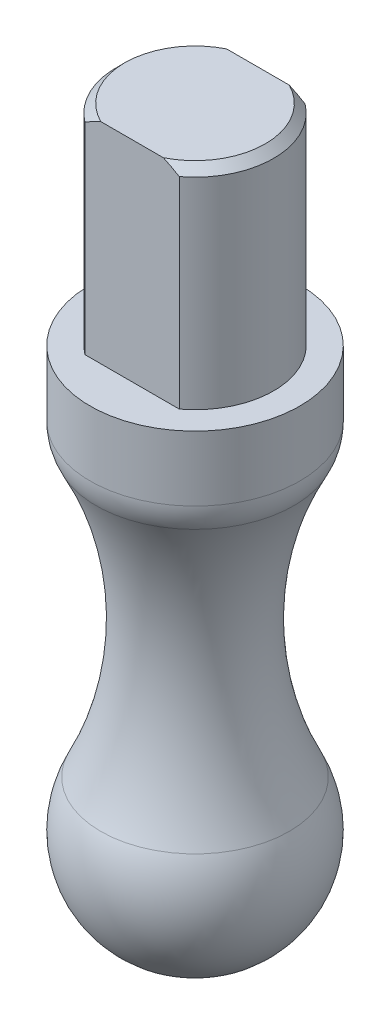
ISO-10303-21;
HEADER;
FILE_DESCRIPTION(('STEP AP214'),'2;1');
FILE_NAME('part.step','',(''),(''),'','','');
FILE_SCHEMA(('AUTOMOTIVE_DESIGN { 1 0 10303 214 1 1 1 1 }'));
ENDSEC;
DATA;
#1=APPLICATION_CONTEXT('core data for automotive mechanical design processes');
#2=APPLICATION_PROTOCOL_DEFINITION('international standard','automotive_design',2000,#1);
#3=PRODUCT_CONTEXT('',#1,'mechanical');
#4=PRODUCT('Part','Part','',(#3));
#5=PRODUCT_RELATED_PRODUCT_CATEGORY('part','',(#4));
#6=PRODUCT_DEFINITION_FORMATION('','',#4);
#7=PRODUCT_DEFINITION_CONTEXT('part definition',#1,'design');
#8=PRODUCT_DEFINITION('design','',#6,#7);
#9=PRODUCT_DEFINITION_SHAPE('','',#8);
#10=(LENGTH_UNIT() NAMED_UNIT(*) SI_UNIT(.MILLI.,.METRE.));
#11=(NAMED_UNIT(*) PLANE_ANGLE_UNIT() SI_UNIT($,.RADIAN.));
#12=(NAMED_UNIT(*) SI_UNIT($,.STERADIAN.) SOLID_ANGLE_UNIT());
#13=UNCERTAINTY_MEASURE_WITH_UNIT(LENGTH_MEASURE(1.E-05),#10,'distance_accuracy_value','');
#14=(GEOMETRIC_REPRESENTATION_CONTEXT(3) GLOBAL_UNCERTAINTY_ASSIGNED_CONTEXT((#13)) GLOBAL_UNIT_ASSIGNED_CONTEXT((#10,
#11,#12)) REPRESENTATION_CONTEXT('',''));
#15=CARTESIAN_POINT('',(0.,0.,0.));
#16=DIRECTION('',(0.,0.,1.));
#17=DIRECTION('',(1.,0.,0.));
#18=AXIS2_PLACEMENT_3D('',#15,#16,#17);
#19=CARTESIAN_POINT('',(0.,0.,0.));
#20=DIRECTION('',(0.,-1.,0.));
#21=DIRECTION('',(0.,0.,-1.));
#22=AXIS2_PLACEMENT_3D('',#19,#20,#21);
#23=CYLINDRICAL_SURFACE('',#22,9.52500000000001);
#24=CARTESIAN_POINT('',(0.,-1.01600000000001,0.));
#25=DIRECTION('',(0.,1.,0.));
#26=DIRECTION('',(0.,0.,1.));
#27=AXIS2_PLACEMENT_3D('',#24,#25,#26);
#28=CIRCLE('',#27,9.52500000000001);
#29=CARTESIAN_POINT('',(-5.71500000000001,-1.01600000000001,7.62));
#30=VERTEX_POINT('',#29);
#31=CARTESIAN_POINT('',(-5.71500000000001,-1.01600000000001,-7.62));
#32=VERTEX_POINT('',#31);
#33=EDGE_CURVE('E128',#30,#32,#28,.F.);
#34=ORIENTED_EDGE('',*,*,#33,.T.);
#35=DIRECTION('',(0.,1.,0.));
#36=VECTOR('',#35,1.);
#37=CARTESIAN_POINT('',(-5.71500000000001,-36.9876626202181,-7.62));
#38=LINE('',#37,#36);
#39=CARTESIAN_POINT('',(-5.71500000000001,-25.4,-7.62));
#40=VERTEX_POINT('',#39);
#41=EDGE_CURVE('E99',#40,#32,#38,.T.);
#42=ORIENTED_EDGE('',*,*,#41,.F.);
#43=CARTESIAN_POINT('',(0.,-25.4,0.));
#44=DIRECTION('',(0.,-1.,0.));
#45=DIRECTION('',(0.,0.,-1.));
#46=AXIS2_PLACEMENT_3D('',#43,#44,#45);
#47=CIRCLE('',#46,9.525);
#48=CARTESIAN_POINT('',(-5.71500000000001,-25.4,7.62));
#49=VERTEX_POINT('',#48);
#50=EDGE_CURVE('E108',#49,#40,#47,.T.);
#51=ORIENTED_EDGE('',*,*,#50,.F.);
#52=DIRECTION('',(0.,1.,0.));
#53=VECTOR('',#52,1.);
#54=CARTESIAN_POINT('',(-5.71500000000001,-36.9876626202181,7.62));
#55=LINE('',#54,#53);
#56=EDGE_CURVE('E187',#49,#30,#55,.T.);
#57=ORIENTED_EDGE('',*,*,#56,.T.);
#58=EDGE_LOOP('',(#34,#42,#51,#57));
#59=FACE_BOUND('',#58,.T.);
#60=ADVANCED_FACE('F34',(#59),#23,.T.);
#61=CARTESIAN_POINT('',(0.,-1.01600000000001,0.));
#62=DIRECTION('',(0.,-1.,0.));
#63=DIRECTION('',(0.,0.,-1.));
#64=AXIS2_PLACEMENT_3D('',#61,#62,#63);
#65=CONICAL_SURFACE('',#64,9.52500000000001,0.785398163397449);
#66=CARTESIAN_POINT('',(-12.6002400260275,-6.21616379241686,-7.62));
#67=CARTESIAN_POINT('',(-12.4119264966585,-6.05502939329435,-7.62));
#68=CARTESIAN_POINT('',(-12.2231401457723,-5.89444801391057,-7.62));
#69=CARTESIAN_POINT('',(-11.8444971887159,-5.57454492782977,-7.62));
#70=CARTESIAN_POINT('',(-11.6546405618792,-5.41522324560065,-7.62));
#71=CARTESIAN_POINT('',(-11.0830984830118,-4.93922861497026,-7.62));
#72=CARTESIAN_POINT('',(-10.6996292815108,-4.6246878556136,-7.62));
#73=CARTESIAN_POINT('',(-9.91639165935729,-3.99474337740364,-7.62));
#74=CARTESIAN_POINT('',(-9.51646133209357,-3.67954051124963,-7.62));
#75=CARTESIAN_POINT('',(-8.70855353596993,-3.0597482007805,-7.62));
#76=CARTESIAN_POINT('',(-8.30057812662822,-2.75515609398979,-7.62));
#77=CARTESIAN_POINT('',(-7.68026695510987,-2.30905739565239,-7.62));
#78=CARTESIAN_POINT('',(-7.47190584485932,-2.1620232317329,-7.62));
#79=CARTESIAN_POINT('',(-7.05210463521392,-1.87239896676503,-7.62));
#80=CARTESIAN_POINT('',(-6.84066450012905,-1.72980891729016,-7.62));
#81=CARTESIAN_POINT('',(-6.41407234461868,-1.44985552219947,-7.62));
#82=CARTESIAN_POINT('',(-6.19891719122192,-1.31249693616154,-7.62));
#83=CARTESIAN_POINT('',(-5.76457198568067,-1.04429785721841,-7.62));
#84=CARTESIAN_POINT('',(-5.54538202033874,-0.91345722431372,-7.62));
#85=CARTESIAN_POINT('',(-5.10455175226511,-0.660979042474094,-7.62));
#86=CARTESIAN_POINT('',(-4.88295561732992,-0.539264757605271,-7.62));
#87=CARTESIAN_POINT('',(-4.43468960688682,-0.305436956322044,-7.62));
#88=CARTESIAN_POINT('',(-4.2080191426257,-0.193324561333724,-7.62));
#89=CARTESIAN_POINT('',(-3.74952912308934,0.0188792942806856,-7.62));
#90=CARTESIAN_POINT('',(-3.51771869892728,0.118990319785317,-7.62));
#91=CARTESIAN_POINT('',(-3.04837069776734,0.30469951224618,-7.62));
#92=CARTESIAN_POINT('',(-2.81083468655119,0.3903015966797,-7.62));
#93=CARTESIAN_POINT('',(-2.32262742974571,0.546343159005187,-7.62));
#94=CARTESIAN_POINT('',(-2.07177721989617,0.616230901844984,-7.62));
#95=CARTESIAN_POINT('',(-1.56489411798422,0.733872673064761,-7.62));
#96=CARTESIAN_POINT('',(-1.30886205630714,0.781630218926455,-7.62));
#97=CARTESIAN_POINT('',(-0.794509923851618,0.851904511274271,-7.62));
#98=CARTESIAN_POINT('',(-0.536206146430472,0.87453822094371,-7.62));
#99=CARTESIAN_POINT('',(-0.0186257909267567,0.893365435879163,-7.62));
#100=CARTESIAN_POINT('',(0.240650749791294,0.889559946509033,-7.62));
#101=CARTESIAN_POINT('',(0.756999941778125,0.855820538821561,-7.62));
#102=CARTESIAN_POINT('',(1.01407568534686,0.825932955063539,-7.62));
#103=CARTESIAN_POINT('',(1.52424659983722,0.742125944816866,-7.62));
#104=CARTESIAN_POINT('',(1.77734110753895,0.688202557276531,-7.62));
#105=CARTESIAN_POINT('',(2.27959418179336,0.559054881547235,-7.62));
#106=CARTESIAN_POINT('',(2.52871938633752,0.483702855105126,-7.62));
#107=CARTESIAN_POINT('',(3.02082548237732,0.3153252840744,-7.62));
#108=CARTESIAN_POINT('',(3.26380659530057,0.22230037743229,-7.62));
#109=CARTESIAN_POINT('',(3.8213452619585,-0.0106070970840159,-7.62));
#110=CARTESIAN_POINT('',(4.13362325801316,-0.155911915846366,-7.62));
#111=CARTESIAN_POINT('',(4.74865256123287,-0.465601220168267,-7.62));
#112=CARTESIAN_POINT('',(5.05139782093388,-0.629997519062329,-7.62));
#113=CARTESIAN_POINT('',(5.64922945844923,-0.973522934547469,-7.62));
#114=CARTESIAN_POINT('',(5.94429752965996,-1.15268365484506,-7.62));
#115=CARTESIAN_POINT('',(6.52736312050582,-1.52195251577871,-7.62));
#116=CARTESIAN_POINT('',(6.81536214993626,-1.71205828925174,-7.62));
#117=CARTESIAN_POINT('',(7.3868736761207,-2.10167475802216,-7.62));
#118=CARTESIAN_POINT('',(7.67035890043474,-2.30122527016792,-7.62));
#119=CARTESIAN_POINT('',(8.23246509693453,-2.7070638201756,-7.62));
#120=CARTESIAN_POINT('',(8.51108586142825,-2.91335214463962,-7.62));
#121=CARTESIAN_POINT('',(9.06394196585718,-3.33104676435875,-7.62));
#122=CARTESIAN_POINT('',(9.33818204763345,-3.54244680075092,-7.62));
#123=CARTESIAN_POINT('',(9.88326105206111,-3.96956491620191,-7.62));
#124=CARTESIAN_POINT('',(10.1541000602249,-4.18528288634076,-7.62));
#125=CARTESIAN_POINT('',(10.6078680283619,-4.55160727014048,-7.62));
#126=CARTESIAN_POINT('',(10.7915592383848,-4.70127179174927,-7.62));
#127=CARTESIAN_POINT('',(11.157769274685,-5.00207963672458,-7.62));
#128=CARTESIAN_POINT('',(11.3402879322232,-5.15322316536952,-7.62));
#129=CARTESIAN_POINT('',(11.8835658120429,-5.60638333492903,-7.62));
#130=CARTESIAN_POINT('',(12.2427360930293,-5.91030865330994,-7.62));
#131=CARTESIAN_POINT('',(12.6002400260275,-6.21616379241686,-7.62));
#132=B_SPLINE_CURVE_WITH_KNOTS('',3,(#66,#67,#68,#69,#70,#71,#72,#73,#74,#75,#76,#77,#78,#79,
#80,#81,#82,#83,#84,#85,#86,#87,#88,#89,#90,#91,#92,#93,#94,#95,#96,#97,#98,#99,#100,#101,#102,
#103,#104,#105,#106,#107,#108,#109,#110,#111,#112,#113,#114,#115,#116,#117,#118,#119,#120,#121,
#122,#123,#124,#125,#126,#127,#128,#129,#130,#131),.UNSPECIFIED.,.F.,.F.,(4,2,2,2,2,2,2,2,2,2,2,
2,2,2,2,2,2,2,2,2,2,2,2,2,2,2,2,2,2,2,2,2,4),(0.,0.743527399462891,1.48706920562252,
2.9748978392196,4.50241980631399,6.0295556821203,6.79456015054187,7.55957349346202,
8.32526698157907,9.09094401622405,9.84921960726939,10.6075836385825,11.3646940543821,
12.1215997202925,12.901948406713,13.6821730181177,14.4587498838199,15.2352972199574,
16.0104678299874,16.785766233818,17.5657867939553,18.3457792026613,19.3781539430998,
20.411170929763,21.4464596089162,22.4815252140021,23.5214302555219,24.5613795885839,
25.6001143259029,26.6388228940515,27.3496439343892,28.0605650732572,29.4720246717876),.UNSPECIFIED.);
#133=CARTESIAN_POINT('',(-3.78664508503239,0.,-7.62));
#134=VERTEX_POINT('',#133);
#135=EDGE_CURVE('E11',#32,#134,#132,.T.);
#136=ORIENTED_EDGE('',*,*,#135,.F.);
#137=ORIENTED_EDGE('',*,*,#33,.F.);
#138=CARTESIAN_POINT('',(12.6002400260275,-6.21616379241686,7.62));
#139=CARTESIAN_POINT('',(12.4119264966585,-6.05502939329435,7.62));
#140=CARTESIAN_POINT('',(12.2231401457723,-5.89444801391057,7.62));
#141=CARTESIAN_POINT('',(11.8444971887159,-5.57454492782977,7.62));
#142=CARTESIAN_POINT('',(11.6546405618792,-5.41522324560064,7.62));
#143=CARTESIAN_POINT('',(11.0830984830118,-4.93922861497026,7.62));
#144=CARTESIAN_POINT('',(10.6996292815108,-4.6246878556136,7.62));
#145=CARTESIAN_POINT('',(9.91639165935728,-3.99474337740364,7.62));
#146=CARTESIAN_POINT('',(9.51646133209356,-3.67954051124962,7.62));
#147=CARTESIAN_POINT('',(8.70855353596992,-3.0597482007805,7.62));
#148=CARTESIAN_POINT('',(8.30057812662821,-2.75515609398978,7.62));
#149=CARTESIAN_POINT('',(7.68026695510986,-2.30905739565239,7.62));
#150=CARTESIAN_POINT('',(7.47190584485931,-2.16202323173289,7.62));
#151=CARTESIAN_POINT('',(7.05210463521392,-1.87239896676502,7.62));
#152=CARTESIAN_POINT('',(6.84066450012904,-1.72980891729016,7.62));
#153=CARTESIAN_POINT('',(6.41407234461867,-1.44985552219947,7.62));
#154=CARTESIAN_POINT('',(6.19891719122191,-1.31249693616154,7.62));
#155=CARTESIAN_POINT('',(5.76457198568066,-1.04429785721841,7.62));
#156=CARTESIAN_POINT('',(5.54538202033873,-0.913457224313717,7.62));
#157=CARTESIAN_POINT('',(5.1045517522651,-0.660979042474091,7.62));
#158=CARTESIAN_POINT('',(4.88295561732991,-0.539264757605267,7.62));
#159=CARTESIAN_POINT('',(4.43468960688681,-0.30543695632204,7.62));
#160=CARTESIAN_POINT('',(4.20801914262569,-0.19332456133372,7.62));
#161=CARTESIAN_POINT('',(3.74952912308932,0.0188792942806886,7.62));
#162=CARTESIAN_POINT('',(3.51771869892727,0.118990319785319,7.62));
#163=CARTESIAN_POINT('',(3.04837069776733,0.304699512246182,7.62));
#164=CARTESIAN_POINT('',(2.81083468655118,0.390301596679702,7.62));
#165=CARTESIAN_POINT('',(2.32262742974569,0.546343159005189,7.62));
#166=CARTESIAN_POINT('',(2.07177721989616,0.616230901844986,7.62));
#167=CARTESIAN_POINT('',(1.5648941179842,0.733872673064762,7.62));
#168=CARTESIAN_POINT('',(1.30886205630713,0.781630218926456,7.62));
#169=CARTESIAN_POINT('',(0.794509923851605,0.85190451127427,7.62));
#170=CARTESIAN_POINT('',(0.53620614643046,0.874538220943708,7.62));
#171=CARTESIAN_POINT('',(0.0186257909267445,0.893365435879161,7.62));
#172=CARTESIAN_POINT('',(-0.240650749791306,0.889559946509032,7.62));
#173=CARTESIAN_POINT('',(-0.756999941778136,0.855820538821559,7.62));
#174=CARTESIAN_POINT('',(-1.01407568534688,0.825932955063536,7.62));
#175=CARTESIAN_POINT('',(-1.52424659983723,0.74212594481686,7.62));
#176=CARTESIAN_POINT('',(-1.77734110753896,0.688202557276526,7.62));
#177=CARTESIAN_POINT('',(-2.27959418179337,0.55905488154723,7.62));
#178=CARTESIAN_POINT('',(-2.52871938633753,0.483702855105121,7.62));
#179=CARTESIAN_POINT('',(-3.02082548237733,0.315325284074395,7.62));
#180=CARTESIAN_POINT('',(-3.26380659530058,0.222300377432284,7.62));
#181=CARTESIAN_POINT('',(-3.82134526195851,-0.0106070970840221,7.62));
#182=CARTESIAN_POINT('',(-4.13362325801318,-0.155911915846374,7.62));
#183=CARTESIAN_POINT('',(-4.74865256123288,-0.465601220168277,7.62));
#184=CARTESIAN_POINT('',(-5.0513978209339,-0.629997519062341,7.62));
#185=CARTESIAN_POINT('',(-5.64922945844926,-0.973522934547484,7.62));
#186=CARTESIAN_POINT('',(-5.94429752965999,-1.15268365484507,7.62));
#187=CARTESIAN_POINT('',(-6.52736312050584,-1.52195251577873,7.62));
#188=CARTESIAN_POINT('',(-6.81536214993628,-1.71205828925176,7.62));
#189=CARTESIAN_POINT('',(-7.38687367612073,-2.10167475802219,7.62));
#190=CARTESIAN_POINT('',(-7.67035890043477,-2.30122527016794,7.62));
#191=CARTESIAN_POINT('',(-8.23246509693457,-2.70706382017563,7.62));
#192=CARTESIAN_POINT('',(-8.51108586142828,-2.91335214463965,7.62));
#193=CARTESIAN_POINT('',(-9.06394196585721,-3.33104676435878,7.62));
#194=CARTESIAN_POINT('',(-9.33818204763349,-3.54244680075095,7.62));
#195=CARTESIAN_POINT('',(-9.88326105206115,-3.96956491620195,7.62));
#196=CARTESIAN_POINT('',(-10.154100060225,-4.1852828863408,7.62));
#197=CARTESIAN_POINT('',(-10.6078680283619,-4.55160727014051,7.62));
#198=CARTESIAN_POINT('',(-10.7915592383849,-4.7012717917493,7.62));
#199=CARTESIAN_POINT('',(-11.157769274685,-5.0020796367246,7.62));
#200=CARTESIAN_POINT('',(-11.3402879322232,-5.15322316536954,7.62));
#201=CARTESIAN_POINT('',(-11.8835658120429,-5.60638333492904,7.62));
#202=CARTESIAN_POINT('',(-12.2427360930293,-5.91030865330994,7.62));
#203=CARTESIAN_POINT('',(-12.6002400260275,-6.21616379241686,7.62));
#204=B_SPLINE_CURVE_WITH_KNOTS('',3,(#138,#139,#140,#141,#142,#143,#144,#145,#146,#147,#148,
#149,#150,#151,#152,#153,#154,#155,#156,#157,#158,#159,#160,#161,#162,#163,#164,#165,#166,#167,
#168,#169,#170,#171,#172,#173,#174,#175,#176,#177,#178,#179,#180,#181,#182,#183,#184,#185,#186,
#187,#188,#189,#190,#191,#192,#193,#194,#195,#196,#197,#198,#199,#200,#201,#202,#203),
.UNSPECIFIED.,.F.,.F.,(4,2,2,2,2,2,2,2,2,2,2,2,2,2,2,2,2,2,2,2,2,2,2,2,2,2,2,2,2,2,2,2,4),(0.,
0.743527399462892,1.48706920562252,2.97489783921961,4.50241980631399,6.02955568212031,
6.79456015054187,7.55957349346202,8.32526698157908,9.09094401622406,9.84921960726939,
10.6075836385825,11.3646940543821,12.1215997202925,12.901948406713,13.6821730181177,
14.4587498838199,15.2352972199575,16.0104678299874,16.785766233818,17.5657867939553,
18.3457792026613,19.3781539430998,20.4111709297631,21.4464596089162,22.4815252140022,
23.5214302555219,24.5613795885839,25.6001143259029,26.6388228940515,27.3496439343892,
28.0605650732572,29.4720246717876),.UNSPECIFIED.);
#205=CARTESIAN_POINT('',(-3.78664508503239,0.,7.62));
#206=VERTEX_POINT('',#205);
#207=EDGE_CURVE('E133',#206,#30,#204,.T.);
#208=ORIENTED_EDGE('',*,*,#207,.F.);
#209=CARTESIAN_POINT('',(0.,0.,0.));
#210=DIRECTION('',(0.,1.,0.));
#211=DIRECTION('',(0.,0.,1.));
#212=AXIS2_PLACEMENT_3D('',#209,#210,#211);
#213=CIRCLE('',#212,8.509);
#214=EDGE_CURVE('E61',#134,#206,#213,.T.);
#215=ORIENTED_EDGE('',*,*,#214,.F.);
#216=EDGE_LOOP('',(#136,#137,#208,#215));
#217=FACE_BOUND('',#216,.T.);
#218=ADVANCED_FACE('F152',(#217),#65,.T.);
#219=CARTESIAN_POINT('',(0.,-33.2643656592481,0.));
#220=DIRECTION('',(0.,-1.,0.));
#221=DIRECTION('',(0.,0.,-1.));
#222=AXIS2_PLACEMENT_3D('',#219,#220,#221);
#223=TOROIDAL_SURFACE('',#222,6.35000000000001,6.34999999999999);
#224=CARTESIAN_POINT('',(0.,-36.2230277079269,0.));
#225=DIRECTION('',(0.,-1.,0.));
#226=DIRECTION('',(0.,0.,-1.));
#227=AXIS2_PLACEMENT_3D('',#224,#225,#226);
#228=CIRCLE('',#227,11.9686136085077);
#229=CARTESIAN_POINT('',(0.,-36.2230277079269,-11.9686136085077));
#230=VERTEX_POINT('',#229);
#231=EDGE_CURVE('E118',#230,#230,#228,.T.);
#232=ORIENTED_EDGE('',*,*,#231,.F.);
#233=EDGE_LOOP('',(#232));
#234=FACE_BOUND('',#233,.T.);
#235=CARTESIAN_POINT('',(0.,-33.2643656592481,0.));
#236=DIRECTION('',(0.,-1.,0.));
#237=DIRECTION('',(0.,0.,-1.));
#238=AXIS2_PLACEMENT_3D('',#235,#236,#237);
#239=CIRCLE('',#238,12.7);
#240=CARTESIAN_POINT('',(0.,-33.2643656592481,-12.7));
#241=VERTEX_POINT('',#240);
#242=EDGE_CURVE('E124',#241,#241,#239,.T.);
#243=ORIENTED_EDGE('',*,*,#242,.T.);
#244=EDGE_LOOP('',(#243));
#245=FACE_BOUND('',#244,.T.);
#246=ADVANCED_FACE('F36',(#234,#245),#223,.T.);
#247=CARTESIAN_POINT('',(0.,0.,0.));
#248=DIRECTION('',(0.,-1.,0.));
#249=DIRECTION('',(0.,0.,-1.));
#250=AXIS2_PLACEMENT_3D('',#247,#248,#249);
#251=CYLINDRICAL_SURFACE('',#250,12.7);
#252=ORIENTED_EDGE('',*,*,#242,.F.);
#253=EDGE_LOOP('',(#252));
#254=FACE_BOUND('',#253,.T.);
#255=CARTESIAN_POINT('',(0.,-25.4,0.));
#256=DIRECTION('',(0.,-1.,0.));
#257=DIRECTION('',(0.,0.,-1.));
#258=AXIS2_PLACEMENT_3D('',#255,#256,#257);
#259=CIRCLE('',#258,12.7);
#260=CARTESIAN_POINT('',(0.,-25.4,-12.7));
#261=VERTEX_POINT('',#260);
#262=EDGE_CURVE('E116',#261,#261,#259,.T.);
#263=ORIENTED_EDGE('',*,*,#262,.T.);
#264=EDGE_LOOP('',(#263));
#265=FACE_BOUND('',#264,.T.);
#266=ADVANCED_FACE('F168',(#254,#265),#251,.T.);
#267=CARTESIAN_POINT('',(-0.0670260647395414,-25.4,0.));
#268=DIRECTION('',(0.,-1.,0.));
#269=DIRECTION('',(0.,0.,-1.));
#270=AXIS2_PLACEMENT_3D('',#267,#268,#269);
#271=PLANE('',#270);
#272=ORIENTED_EDGE('',*,*,#262,.F.);
#273=EDGE_LOOP('',(#272));
#274=FACE_BOUND('',#273,.T.);
#275=ORIENTED_EDGE('',*,*,#50,.T.);
#276=DIRECTION('',(1.,0.,0.));
#277=VECTOR('',#276,1.);
#278=CARTESIAN_POINT('',(5.71500000000001,-25.4,-7.62));
#279=LINE('',#278,#277);
#280=CARTESIAN_POINT('',(5.71500000000001,-25.4,-7.62));
#281=VERTEX_POINT('',#280);
#282=EDGE_CURVE('E94',#40,#281,#279,.T.);
#283=ORIENTED_EDGE('',*,*,#282,.T.);
#284=CARTESIAN_POINT('',(5.71500000000001,-25.4,7.62));
#285=VERTEX_POINT('',#284);
#286=EDGE_CURVE('E105',#281,#285,#47,.T.);
#287=ORIENTED_EDGE('',*,*,#286,.T.);
#288=DIRECTION('',(-1.,0.,0.));
#289=VECTOR('',#288,1.);
#290=CARTESIAN_POINT('',(5.71500000000001,-25.4,7.62));
#291=LINE('',#290,#289);
#292=EDGE_CURVE('E192',#285,#49,#291,.T.);
#293=ORIENTED_EDGE('',*,*,#292,.T.);
#294=EDGE_LOOP('',(#275,#283,#287,#293));
#295=FACE_BOUND('',#294,.T.);
#296=ADVANCED_FACE('F103',(#274,#295),#271,.F.);
#297=ORIENTED_EDGE('',*,*,#286,.F.);
#298=DIRECTION('',(0.,1.,0.));
#299=VECTOR('',#298,1.);
#300=CARTESIAN_POINT('',(5.71500000000001,-36.9876626202181,-7.62));
#301=LINE('',#300,#299);
#302=CARTESIAN_POINT('',(5.71500000000001,-1.01600000000001,-7.62));
#303=VERTEX_POINT('',#302);
#304=EDGE_CURVE('E91',#281,#303,#301,.T.);
#305=ORIENTED_EDGE('',*,*,#304,.T.);
#306=CARTESIAN_POINT('',(5.71500000000001,-1.01600000000001,7.62));
#307=VERTEX_POINT('',#306);
#308=EDGE_CURVE('E127',#303,#307,#28,.F.);
#309=ORIENTED_EDGE('',*,*,#308,.T.);
#310=DIRECTION('',(0.,1.,0.));
#311=VECTOR('',#310,1.);
#312=CARTESIAN_POINT('',(5.71500000000001,-36.9876626202181,7.62));
#313=LINE('',#312,#311);
#314=EDGE_CURVE('E113',#285,#307,#313,.T.);
#315=ORIENTED_EDGE('',*,*,#314,.F.);
#316=EDGE_LOOP('',(#297,#305,#309,#315));
#317=FACE_BOUND('',#316,.T.);
#318=ADVANCED_FACE('F111',(#317),#23,.T.);
#319=CARTESIAN_POINT('',(-0.0670260647395414,0.,0.));
#320=DIRECTION('',(0.,1.,0.));
#321=DIRECTION('',(0.,0.,1.));
#322=AXIS2_PLACEMENT_3D('',#319,#320,#321);
#323=PLANE('',#322);
#324=DIRECTION('',(1.,0.,0.));
#325=VECTOR('',#324,1.);
#326=CARTESIAN_POINT('',(5.71500000000001,0.,-7.62));
#327=LINE('',#326,#325);
#328=CARTESIAN_POINT('',(3.78664508503239,0.,-7.62));
#329=VERTEX_POINT('',#328);
#330=EDGE_CURVE('E54',#134,#329,#327,.T.);
#331=ORIENTED_EDGE('',*,*,#330,.F.);
#332=ORIENTED_EDGE('',*,*,#214,.T.);
#333=DIRECTION('',(-1.,0.,0.));
#334=VECTOR('',#333,1.);
#335=CARTESIAN_POINT('',(5.71500000000001,0.,7.62));
#336=LINE('',#335,#334);
#337=CARTESIAN_POINT('',(3.78664508503239,0.,7.62));
#338=VERTEX_POINT('',#337);
#339=EDGE_CURVE('E194',#338,#206,#336,.T.);
#340=ORIENTED_EDGE('',*,*,#339,.F.);
#341=EDGE_CURVE('E131',#338,#329,#213,.T.);
#342=ORIENTED_EDGE('',*,*,#341,.T.);
#343=EDGE_LOOP('',(#331,#332,#340,#342));
#344=FACE_BOUND('',#343,.T.);
#345=ADVANCED_FACE('F162',(#344),#323,.T.);
#346=CARTESIAN_POINT('',(0.,-76.2,0.));
#347=DIRECTION('',(0.,-1.,0.));
#348=DIRECTION('',(1.,0.,0.));
#349=AXIS2_PLACEMENT_3D('',#346,#347,#348);
#350=SPHERICAL_SURFACE('',#349,12.7);
#351=CARTESIAN_POINT('',(0.,-70.64375,0.));
#352=DIRECTION('',(0.,-1.,0.));
#353=DIRECTION('',(0.,0.,-1.));
#354=AXIS2_PLACEMENT_3D('',#351,#352,#353);
#355=CIRCLE('',#354,11.4200738148884);
#356=CARTESIAN_POINT('',(0.,-70.64375,-11.4200738148884));
#357=VERTEX_POINT('',#356);
#358=EDGE_CURVE('E114',#357,#357,#355,.T.);
#359=ORIENTED_EDGE('',*,*,#358,.T.);
#360=EDGE_LOOP('',(#359));
#361=FACE_BOUND('',#360,.T.);
#362=ADVANCED_FACE('F167',(#361),#350,.T.);
#363=CARTESIAN_POINT('',(0.,-53.975,0.));
#364=DIRECTION('',(0.,-1.,0.));
#365=DIRECTION('',(0.,0.,-1.));
#366=AXIS2_PLACEMENT_3D('',#363,#364,#365);
#367=TOROIDAL_SURFACE('',#366,45.6802952595537,38.1);
#368=ORIENTED_EDGE('',*,*,#358,.F.);
#369=EDGE_LOOP('',(#368));
#370=FACE_BOUND('',#369,.T.);
#371=ORIENTED_EDGE('',*,*,#231,.T.);
#372=EDGE_LOOP('',(#371));
#373=FACE_BOUND('',#372,.T.);
#374=ADVANCED_FACE('F204',(#370,#373),#367,.F.);
#375=EDGE_CURVE('E38',#329,#303,#132,.T.);
#376=ORIENTED_EDGE('',*,*,#375,.F.);
#377=ORIENTED_EDGE('',*,*,#341,.F.);
#378=EDGE_CURVE('E139',#307,#338,#204,.T.);
#379=ORIENTED_EDGE('',*,*,#378,.F.);
#380=ORIENTED_EDGE('',*,*,#308,.F.);
#381=EDGE_LOOP('',(#376,#377,#379,#380));
#382=FACE_BOUND('',#381,.T.);
#383=ADVANCED_FACE('F140',(#382),#65,.T.);
#384=CARTESIAN_POINT('',(5.71500000000001,-36.9876626202181,7.62));
#385=DIRECTION('',(0.,0.,-1.));
#386=DIRECTION('',(-1.,0.,0.));
#387=AXIS2_PLACEMENT_3D('',#384,#385,#386);
#388=PLANE('',#387);
#389=ORIENTED_EDGE('',*,*,#378,.T.);
#390=ORIENTED_EDGE('',*,*,#339,.T.);
#391=ORIENTED_EDGE('',*,*,#207,.T.);
#392=ORIENTED_EDGE('',*,*,#56,.F.);
#393=ORIENTED_EDGE('',*,*,#292,.F.);
#394=ORIENTED_EDGE('',*,*,#314,.T.);
#395=EDGE_LOOP('',(#389,#390,#391,#392,#393,#394));
#396=FACE_BOUND('',#395,.T.);
#397=ADVANCED_FACE('F143',(#396),#388,.F.);
#398=CARTESIAN_POINT('',(5.71500000000001,-36.9876626202181,-7.62));
#399=DIRECTION('',(0.,0.,1.));
#400=DIRECTION('',(1.,0.,0.));
#401=AXIS2_PLACEMENT_3D('',#398,#399,#400);
#402=PLANE('',#401);
#403=ORIENTED_EDGE('',*,*,#135,.T.);
#404=ORIENTED_EDGE('',*,*,#330,.T.);
#405=ORIENTED_EDGE('',*,*,#375,.T.);
#406=ORIENTED_EDGE('',*,*,#304,.F.);
#407=ORIENTED_EDGE('',*,*,#282,.F.);
#408=ORIENTED_EDGE('',*,*,#41,.T.);
#409=EDGE_LOOP('',(#403,#404,#405,#406,#407,#408));
#410=FACE_BOUND('',#409,.T.);
#411=ADVANCED_FACE('F93',(#410),#402,.F.);
#412=CLOSED_SHELL('',(#60,#218,#246,#266,#296,#318,#345,#362,#374,#383,#397,#411));
#413=MANIFOLD_SOLID_BREP('B2',#412);
#414=ADVANCED_BREP_SHAPE_REPRESENTATION('',(#18,#413),#14);
#415=SHAPE_DEFINITION_REPRESENTATION(#9,#414);
ENDSEC;
END-ISO-10303-21;
